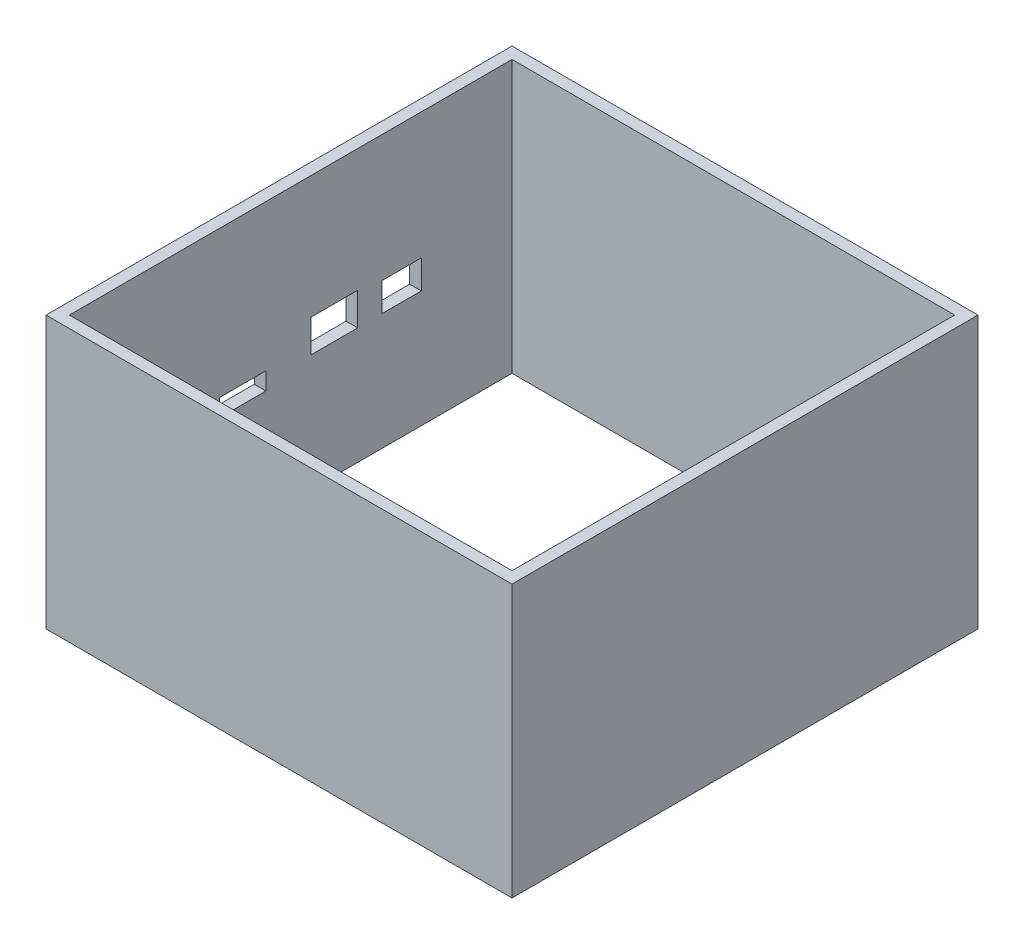
ISO-10303-21;
HEADER;
FILE_DESCRIPTION(('STEP AP214'),'2;1');
FILE_NAME('part.step','',(''),(''),'','','');
FILE_SCHEMA(('AUTOMOTIVE_DESIGN { 1 0 10303 214 1 1 1 1 }'));
ENDSEC;
DATA;
#1=APPLICATION_CONTEXT('core data for automotive mechanical design processes');
#2=APPLICATION_PROTOCOL_DEFINITION('international standard','automotive_design',2000,#1);
#3=PRODUCT_CONTEXT('',#1,'mechanical');
#4=PRODUCT('Part','Part','',(#3));
#5=PRODUCT_RELATED_PRODUCT_CATEGORY('part','',(#4));
#6=PRODUCT_DEFINITION_FORMATION('','',#4);
#7=PRODUCT_DEFINITION_CONTEXT('part definition',#1,'design');
#8=PRODUCT_DEFINITION('design','',#6,#7);
#9=PRODUCT_DEFINITION_SHAPE('','',#8);
#10=(LENGTH_UNIT() NAMED_UNIT(*) SI_UNIT(.MILLI.,.METRE.));
#11=(NAMED_UNIT(*) PLANE_ANGLE_UNIT() SI_UNIT($,.RADIAN.));
#12=(NAMED_UNIT(*) SI_UNIT($,.STERADIAN.) SOLID_ANGLE_UNIT());
#13=UNCERTAINTY_MEASURE_WITH_UNIT(LENGTH_MEASURE(1.E-05),#10,'distance_accuracy_value','');
#14=(GEOMETRIC_REPRESENTATION_CONTEXT(3) GLOBAL_UNCERTAINTY_ASSIGNED_CONTEXT((#13)) GLOBAL_UNIT_ASSIGNED_CONTEXT((#10,
#11,#12)) REPRESENTATION_CONTEXT('',''));
#15=CARTESIAN_POINT('',(0.,0.,0.));
#16=DIRECTION('',(0.,0.,1.));
#17=DIRECTION('',(1.,0.,0.));
#18=AXIS2_PLACEMENT_3D('',#15,#16,#17);
#19=CARTESIAN_POINT('',(-60.,73.,60.));
#20=DIRECTION('',(1.,0.,0.));
#21=DIRECTION('',(0.,0.,-1.));
#22=AXIS2_PLACEMENT_3D('',#19,#20,#21);
#23=PLANE('',#22);
#24=DIRECTION('',(0.,1.,0.));
#25=VECTOR('',#24,1.);
#26=CARTESIAN_POINT('',(-60.,0.,18.3674203577471));
#27=LINE('',#26,#25);
#28=CARTESIAN_POINT('',(-60.,30.75,18.3674203577471));
#29=VERTEX_POINT('',#28);
#30=CARTESIAN_POINT('',(-60.,35.25,18.3674203577471));
#31=VERTEX_POINT('',#30);
#32=EDGE_CURVE('E221',#29,#31,#27,.T.);
#33=ORIENTED_EDGE('',*,*,#32,.F.);
#34=DIRECTION('',(0.,0.,1.));
#35=VECTOR('',#34,1.);
#36=CARTESIAN_POINT('',(-60.,30.75,0.));
#37=LINE('',#36,#35);
#38=CARTESIAN_POINT('',(-60.,30.75,6.36742035774705));
#39=VERTEX_POINT('',#38);
#40=EDGE_CURVE('E265',#39,#29,#37,.T.);
#41=ORIENTED_EDGE('',*,*,#40,.F.);
#42=DIRECTION('',(0.,1.,0.));
#43=VECTOR('',#42,1.);
#44=CARTESIAN_POINT('',(-60.,0.,6.36742035774705));
#45=LINE('',#44,#43);
#46=CARTESIAN_POINT('',(-60.,35.25,6.36742035774705));
#47=VERTEX_POINT('',#46);
#48=EDGE_CURVE('E269',#39,#47,#45,.T.);
#49=ORIENTED_EDGE('',*,*,#48,.T.);
#50=DIRECTION('',(0.,0.,1.));
#51=VECTOR('',#50,1.);
#52=CARTESIAN_POINT('',(-60.,35.25,0.));
#53=LINE('',#52,#51);
#54=EDGE_CURVE('E272',#47,#31,#53,.T.);
#55=ORIENTED_EDGE('',*,*,#54,.T.);
#56=EDGE_LOOP('',(#33,#41,#49,#55));
#57=FACE_BOUND('',#56,.T.);
#58=DIRECTION('',(0.,-1.,0.));
#59=VECTOR('',#58,1.);
#60=CARTESIAN_POINT('',(-60.,0.,-23.5647531211439));
#61=LINE('',#60,#59);
#62=CARTESIAN_POINT('',(-60.,40.4239596536926,-23.5647531211439));
#63=VERTEX_POINT('',#62);
#64=CARTESIAN_POINT('',(-60.,33.0619311208175,-23.5647531211439));
#65=VERTEX_POINT('',#64);
#66=EDGE_CURVE('E275',#63,#65,#61,.T.);
#67=ORIENTED_EDGE('',*,*,#66,.T.);
#68=DIRECTION('',(0.,0.,1.));
#69=VECTOR('',#68,1.);
#70=CARTESIAN_POINT('',(-60.,33.0619311208175,0.));
#71=LINE('',#70,#69);
#72=CARTESIAN_POINT('',(-60.,33.0619311208175,-33.6488101868942));
#73=VERTEX_POINT('',#72);
#74=EDGE_CURVE('E290',#73,#65,#71,.T.);
#75=ORIENTED_EDGE('',*,*,#74,.F.);
#76=DIRECTION('',(0.,-1.,0.));
#77=VECTOR('',#76,1.);
#78=CARTESIAN_POINT('',(-60.,0.,-33.6488101868942));
#79=LINE('',#78,#77);
#80=CARTESIAN_POINT('',(-60.,40.4239596536926,-33.6488101868942));
#81=VERTEX_POINT('',#80);
#82=EDGE_CURVE('E284',#81,#73,#79,.T.);
#83=ORIENTED_EDGE('',*,*,#82,.F.);
#84=DIRECTION('',(0.,0.,1.));
#85=VECTOR('',#84,1.);
#86=CARTESIAN_POINT('',(-60.,40.4239596536926,0.));
#87=LINE('',#86,#85);
#88=EDGE_CURVE('E196',#81,#63,#87,.T.);
#89=ORIENTED_EDGE('',*,*,#88,.T.);
#90=EDGE_LOOP('',(#67,#75,#83,#89));
#91=FACE_BOUND('',#90,.T.);
#92=DIRECTION('',(0.,-1.,0.));
#93=VECTOR('',#92,1.);
#94=CARTESIAN_POINT('',(-60.,73.,60.));
#95=LINE('',#94,#93);
#96=CARTESIAN_POINT('',(-60.,73.,60.));
#97=VERTEX_POINT('',#96);
#98=CARTESIAN_POINT('',(-60.,3.,60.));
#99=VERTEX_POINT('',#98);
#100=EDGE_CURVE('E181',#97,#99,#95,.T.);
#101=ORIENTED_EDGE('',*,*,#100,.F.);
#102=DIRECTION('',(0.,0.,1.));
#103=VECTOR('',#102,1.);
#104=CARTESIAN_POINT('',(-60.,73.,-80.));
#105=LINE('',#104,#103);
#106=CARTESIAN_POINT('',(-60.,73.,-60.));
#107=VERTEX_POINT('',#106);
#108=EDGE_CURVE('E43',#107,#97,#105,.T.);
#109=ORIENTED_EDGE('',*,*,#108,.F.);
#110=DIRECTION('',(0.,-1.,0.));
#111=VECTOR('',#110,1.);
#112=CARTESIAN_POINT('',(-60.,73.,-60.));
#113=LINE('',#112,#111);
#114=CARTESIAN_POINT('',(-60.,3.,-60.));
#115=VERTEX_POINT('',#114);
#116=EDGE_CURVE('E189',#107,#115,#113,.T.);
#117=ORIENTED_EDGE('',*,*,#116,.T.);
#118=DIRECTION('',(0.,0.,1.));
#119=VECTOR('',#118,1.);
#120=CARTESIAN_POINT('',(-60.,3.,60.));
#121=LINE('',#120,#119);
#122=EDGE_CURVE('E173',#115,#99,#121,.T.);
#123=ORIENTED_EDGE('',*,*,#122,.T.);
#124=EDGE_LOOP('',(#101,#109,#117,#123));
#125=FACE_BOUND('',#124,.T.);
#126=DIRECTION('',(0.,1.,0.));
#127=VECTOR('',#126,1.);
#128=CARTESIAN_POINT('',(-60.,0.,-17.2594149314277));
#129=LINE('',#128,#127);
#130=CARTESIAN_POINT('',(-60.,33.,-17.2594149314277));
#131=VERTEX_POINT('',#130);
#132=CARTESIAN_POINT('',(-60.,41.4,-17.2594149314277));
#133=VERTEX_POINT('',#132);
#134=EDGE_CURVE('E191',#131,#133,#129,.T.);
#135=ORIENTED_EDGE('',*,*,#134,.T.);
#136=DIRECTION('',(0.,0.,-1.));
#137=VECTOR('',#136,1.);
#138=CARTESIAN_POINT('',(-60.,41.4,0.));
#139=LINE('',#138,#137);
#140=CARTESIAN_POINT('',(-60.,41.4,-5.25941493142768));
#141=VERTEX_POINT('',#140);
#142=EDGE_CURVE('E247',#141,#133,#139,.T.);
#143=ORIENTED_EDGE('',*,*,#142,.F.);
#144=DIRECTION('',(0.,1.,0.));
#145=VECTOR('',#144,1.);
#146=CARTESIAN_POINT('',(-60.,0.,-5.25941493142768));
#147=LINE('',#146,#145);
#148=CARTESIAN_POINT('',(-60.,33.,-5.25941493142768));
#149=VERTEX_POINT('',#148);
#150=EDGE_CURVE('E241',#149,#141,#147,.T.);
#151=ORIENTED_EDGE('',*,*,#150,.F.);
#152=DIRECTION('',(0.,0.,-1.));
#153=VECTOR('',#152,1.);
#154=CARTESIAN_POINT('',(-60.,33.,0.));
#155=LINE('',#154,#153);
#156=EDGE_CURVE('E194',#149,#131,#155,.T.);
#157=ORIENTED_EDGE('',*,*,#156,.T.);
#158=EDGE_LOOP('',(#135,#143,#151,#157));
#159=FACE_BOUND('',#158,.T.);
#160=ADVANCED_FACE('F33',(#57,#91,#125,#159),#23,.F.);
#161=CARTESIAN_POINT('',(-57.,73.,57.));
#162=DIRECTION('',(1.,0.,0.));
#163=DIRECTION('',(0.,0.,-1.));
#164=AXIS2_PLACEMENT_3D('',#161,#162,#163);
#165=PLANE('',#164);
#166=DIRECTION('',(0.,0.,-1.));
#167=VECTOR('',#166,1.);
#168=CARTESIAN_POINT('',(-57.,30.75,57.));
#169=LINE('',#168,#167);
#170=CARTESIAN_POINT('',(-57.,30.75,18.3674203577471));
#171=VERTEX_POINT('',#170);
#172=CARTESIAN_POINT('',(-57.,30.75,6.36742035774705));
#173=VERTEX_POINT('',#172);
#174=EDGE_CURVE('E268',#171,#173,#169,.T.);
#175=ORIENTED_EDGE('',*,*,#174,.F.);
#176=DIRECTION('',(0.,-1.,0.));
#177=VECTOR('',#176,1.);
#178=CARTESIAN_POINT('',(-57.,73.,18.3674203577471));
#179=LINE('',#178,#177);
#180=CARTESIAN_POINT('',(-57.,35.25,18.3674203577471));
#181=VERTEX_POINT('',#180);
#182=EDGE_CURVE('E260',#181,#171,#179,.T.);
#183=ORIENTED_EDGE('',*,*,#182,.F.);
#184=DIRECTION('',(0.,0.,-1.));
#185=VECTOR('',#184,1.);
#186=CARTESIAN_POINT('',(-57.,35.25,57.));
#187=LINE('',#186,#185);
#188=CARTESIAN_POINT('',(-57.,35.25,6.36742035774705));
#189=VERTEX_POINT('',#188);
#190=EDGE_CURVE('E255',#181,#189,#187,.T.);
#191=ORIENTED_EDGE('',*,*,#190,.T.);
#192=DIRECTION('',(0.,-1.,0.));
#193=VECTOR('',#192,1.);
#194=CARTESIAN_POINT('',(-57.,73.,6.36742035774705));
#195=LINE('',#194,#193);
#196=EDGE_CURVE('E357',#189,#173,#195,.T.);
#197=ORIENTED_EDGE('',*,*,#196,.T.);
#198=EDGE_LOOP('',(#175,#183,#191,#197));
#199=FACE_BOUND('',#198,.T.);
#200=DIRECTION('',(0.,0.,-1.));
#201=VECTOR('',#200,1.);
#202=CARTESIAN_POINT('',(-57.,33.0619311208175,57.));
#203=LINE('',#202,#201);
#204=CARTESIAN_POINT('',(-57.,33.0619311208175,-23.5647531211439));
#205=VERTEX_POINT('',#204);
#206=CARTESIAN_POINT('',(-57.,33.0619311208175,-33.6488101868942));
#207=VERTEX_POINT('',#206);
#208=EDGE_CURVE('E240',#205,#207,#203,.T.);
#209=ORIENTED_EDGE('',*,*,#208,.F.);
#210=DIRECTION('',(0.,1.,0.));
#211=VECTOR('',#210,1.);
#212=CARTESIAN_POINT('',(-57.,73.,-23.5647531211439));
#213=LINE('',#212,#211);
#214=CARTESIAN_POINT('',(-57.,40.4239596536926,-23.5647531211439));
#215=VERTEX_POINT('',#214);
#216=EDGE_CURVE('E341',#205,#215,#213,.T.);
#217=ORIENTED_EDGE('',*,*,#216,.T.);
#218=DIRECTION('',(0.,0.,-1.));
#219=VECTOR('',#218,1.);
#220=CARTESIAN_POINT('',(-57.,40.4239596536926,57.));
#221=LINE('',#220,#219);
#222=CARTESIAN_POINT('',(-57.,40.4239596536926,-33.6488101868942));
#223=VERTEX_POINT('',#222);
#224=EDGE_CURVE('E232',#215,#223,#221,.T.);
#225=ORIENTED_EDGE('',*,*,#224,.T.);
#226=DIRECTION('',(0.,1.,0.));
#227=VECTOR('',#226,1.);
#228=CARTESIAN_POINT('',(-57.,73.,-33.6488101868942));
#229=LINE('',#228,#227);
#230=EDGE_CURVE('E287',#207,#223,#229,.T.);
#231=ORIENTED_EDGE('',*,*,#230,.F.);
#232=EDGE_LOOP('',(#209,#217,#225,#231));
#233=FACE_BOUND('',#232,.T.);
#234=DIRECTION('',(0.,0.,1.));
#235=VECTOR('',#234,1.);
#236=CARTESIAN_POINT('',(-57.,3.,57.));
#237=LINE('',#236,#235);
#238=CARTESIAN_POINT('',(-57.,3.,-57.));
#239=VERTEX_POINT('',#238);
#240=CARTESIAN_POINT('',(-57.,3.,57.));
#241=VERTEX_POINT('',#240);
#242=EDGE_CURVE('E209',#239,#241,#237,.T.);
#243=ORIENTED_EDGE('',*,*,#242,.F.);
#244=DIRECTION('',(0.,-1.,0.));
#245=VECTOR('',#244,1.);
#246=CARTESIAN_POINT('',(-57.,73.,-57.));
#247=LINE('',#246,#245);
#248=CARTESIAN_POINT('',(-57.,73.,-57.));
#249=VERTEX_POINT('',#248);
#250=EDGE_CURVE('E206',#249,#239,#247,.T.);
#251=ORIENTED_EDGE('',*,*,#250,.F.);
#252=DIRECTION('',(0.,0.,1.));
#253=VECTOR('',#252,1.);
#254=CARTESIAN_POINT('',(-57.,73.,57.));
#255=LINE('',#254,#253);
#256=CARTESIAN_POINT('',(-57.,73.,57.));
#257=VERTEX_POINT('',#256);
#258=EDGE_CURVE('E214',#249,#257,#255,.T.);
#259=ORIENTED_EDGE('',*,*,#258,.T.);
#260=DIRECTION('',(0.,-1.,0.));
#261=VECTOR('',#260,1.);
#262=CARTESIAN_POINT('',(-57.,73.,57.));
#263=LINE('',#262,#261);
#264=EDGE_CURVE('E210',#257,#241,#263,.T.);
#265=ORIENTED_EDGE('',*,*,#264,.T.);
#266=EDGE_LOOP('',(#243,#251,#259,#265));
#267=FACE_BOUND('',#266,.T.);
#268=DIRECTION('',(0.,0.,1.));
#269=VECTOR('',#268,1.);
#270=CARTESIAN_POINT('',(-57.,41.4,57.));
#271=LINE('',#270,#269);
#272=CARTESIAN_POINT('',(-57.,41.4,-17.2594149314277));
#273=VERTEX_POINT('',#272);
#274=CARTESIAN_POINT('',(-57.,41.4,-5.25941493142768));
#275=VERTEX_POINT('',#274);
#276=EDGE_CURVE('E248',#273,#275,#271,.T.);
#277=ORIENTED_EDGE('',*,*,#276,.F.);
#278=DIRECTION('',(0.,-1.,0.));
#279=VECTOR('',#278,1.);
#280=CARTESIAN_POINT('',(-57.,73.,-17.2594149314277));
#281=LINE('',#280,#279);
#282=CARTESIAN_POINT('',(-57.,33.,-17.2594149314277));
#283=VERTEX_POINT('',#282);
#284=EDGE_CURVE('E213',#273,#283,#281,.T.);
#285=ORIENTED_EDGE('',*,*,#284,.T.);
#286=DIRECTION('',(0.,0.,1.));
#287=VECTOR('',#286,1.);
#288=CARTESIAN_POINT('',(-57.,33.,57.));
#289=LINE('',#288,#287);
#290=CARTESIAN_POINT('',(-57.,33.,-5.25941493142768));
#291=VERTEX_POINT('',#290);
#292=EDGE_CURVE('E185',#283,#291,#289,.T.);
#293=ORIENTED_EDGE('',*,*,#292,.T.);
#294=DIRECTION('',(0.,-1.,0.));
#295=VECTOR('',#294,1.);
#296=CARTESIAN_POINT('',(-57.,73.,-5.25941493142768));
#297=LINE('',#296,#295);
#298=EDGE_CURVE('E244',#275,#291,#297,.T.);
#299=ORIENTED_EDGE('',*,*,#298,.F.);
#300=EDGE_LOOP('',(#277,#285,#293,#299));
#301=FACE_BOUND('',#300,.T.);
#302=ADVANCED_FACE('F319',(#199,#233,#267,#301),#165,.T.);
#303=CARTESIAN_POINT('',(60.,73.,60.));
#304=DIRECTION('',(0.,0.,-1.));
#305=DIRECTION('',(-1.,0.,0.));
#306=AXIS2_PLACEMENT_3D('',#303,#304,#305);
#307=PLANE('',#306);
#308=DIRECTION('',(0.,-1.,0.));
#309=VECTOR('',#308,1.);
#310=CARTESIAN_POINT('',(60.,73.,60.));
#311=LINE('',#310,#309);
#312=CARTESIAN_POINT('',(60.,73.,60.));
#313=VERTEX_POINT('',#312);
#314=CARTESIAN_POINT('',(60.,3.,60.));
#315=VERTEX_POINT('',#314);
#316=EDGE_CURVE('E301',#313,#315,#311,.T.);
#317=ORIENTED_EDGE('',*,*,#316,.F.);
#318=DIRECTION('',(1.,0.,0.));
#319=VECTOR('',#318,1.);
#320=CARTESIAN_POINT('',(-60.,73.,60.));
#321=LINE('',#320,#319);
#322=EDGE_CURVE('E11',#97,#313,#321,.T.);
#323=ORIENTED_EDGE('',*,*,#322,.F.);
#324=ORIENTED_EDGE('',*,*,#100,.T.);
#325=DIRECTION('',(1.,0.,0.));
#326=VECTOR('',#325,1.);
#327=CARTESIAN_POINT('',(60.,3.,60.));
#328=LINE('',#327,#326);
#329=EDGE_CURVE('E37',#99,#315,#328,.T.);
#330=ORIENTED_EDGE('',*,*,#329,.T.);
#331=EDGE_LOOP('',(#317,#323,#324,#330));
#332=FACE_BOUND('',#331,.T.);
#333=ADVANCED_FACE('F183',(#332),#307,.F.);
#334=CARTESIAN_POINT('',(60.,73.,60.));
#335=DIRECTION('',(-1.,0.,0.));
#336=DIRECTION('',(0.,0.,1.));
#337=AXIS2_PLACEMENT_3D('',#334,#335,#336);
#338=PLANE('',#337);
#339=DIRECTION('',(0.,-1.,0.));
#340=VECTOR('',#339,1.);
#341=CARTESIAN_POINT('',(60.,73.,-60.));
#342=LINE('',#341,#340);
#343=CARTESIAN_POINT('',(60.,73.,-60.));
#344=VERTEX_POINT('',#343);
#345=CARTESIAN_POINT('',(60.,3.,-60.));
#346=VERTEX_POINT('',#345);
#347=EDGE_CURVE('E299',#344,#346,#342,.T.);
#348=ORIENTED_EDGE('',*,*,#347,.F.);
#349=DIRECTION('',(0.,0.,1.));
#350=VECTOR('',#349,1.);
#351=CARTESIAN_POINT('',(60.,73.,-80.));
#352=LINE('',#351,#350);
#353=EDGE_CURVE('E180',#344,#313,#352,.T.);
#354=ORIENTED_EDGE('',*,*,#353,.T.);
#355=ORIENTED_EDGE('',*,*,#316,.T.);
#356=DIRECTION('',(0.,0.,-1.));
#357=VECTOR('',#356,1.);
#358=CARTESIAN_POINT('',(60.,3.,60.));
#359=LINE('',#358,#357);
#360=EDGE_CURVE('E176',#315,#346,#359,.T.);
#361=ORIENTED_EDGE('',*,*,#360,.T.);
#362=EDGE_LOOP('',(#348,#354,#355,#361));
#363=FACE_BOUND('',#362,.T.);
#364=ADVANCED_FACE('F310',(#363),#338,.F.);
#365=CARTESIAN_POINT('',(60.,73.,-60.));
#366=DIRECTION('',(0.,0.,1.));
#367=DIRECTION('',(1.,0.,0.));
#368=AXIS2_PLACEMENT_3D('',#365,#366,#367);
#369=PLANE('',#368);
#370=ORIENTED_EDGE('',*,*,#116,.F.);
#371=DIRECTION('',(1.,0.,0.));
#372=VECTOR('',#371,1.);
#373=CARTESIAN_POINT('',(60.,73.,-60.));
#374=LINE('',#373,#372);
#375=EDGE_CURVE('E51',#107,#344,#374,.T.);
#376=ORIENTED_EDGE('',*,*,#375,.T.);
#377=ORIENTED_EDGE('',*,*,#347,.T.);
#378=DIRECTION('',(-1.,0.,0.));
#379=VECTOR('',#378,1.);
#380=CARTESIAN_POINT('',(60.,3.,-60.));
#381=LINE('',#380,#379);
#382=EDGE_CURVE('E229',#346,#115,#381,.T.);
#383=ORIENTED_EDGE('',*,*,#382,.T.);
#384=EDGE_LOOP('',(#370,#376,#377,#383));
#385=FACE_BOUND('',#384,.T.);
#386=ADVANCED_FACE('F309',(#385),#369,.F.);
#387=CARTESIAN_POINT('',(-57.,73.,57.));
#388=DIRECTION('',(0.,0.,-1.));
#389=DIRECTION('',(-1.,0.,0.));
#390=AXIS2_PLACEMENT_3D('',#387,#388,#389);
#391=PLANE('',#390);
#392=DIRECTION('',(1.,0.,0.));
#393=VECTOR('',#392,1.);
#394=CARTESIAN_POINT('',(-57.,3.,57.));
#395=LINE('',#394,#393);
#396=CARTESIAN_POINT('',(57.,3.,57.));
#397=VERTEX_POINT('',#396);
#398=EDGE_CURVE('E218',#241,#397,#395,.T.);
#399=ORIENTED_EDGE('',*,*,#398,.F.);
#400=ORIENTED_EDGE('',*,*,#264,.F.);
#401=DIRECTION('',(1.,0.,0.));
#402=VECTOR('',#401,1.);
#403=CARTESIAN_POINT('',(-57.,73.,57.));
#404=LINE('',#403,#402);
#405=CARTESIAN_POINT('',(57.,73.,57.));
#406=VERTEX_POINT('',#405);
#407=EDGE_CURVE('E88',#257,#406,#404,.T.);
#408=ORIENTED_EDGE('',*,*,#407,.T.);
#409=DIRECTION('',(0.,-1.,0.));
#410=VECTOR('',#409,1.);
#411=CARTESIAN_POINT('',(57.,73.,57.));
#412=LINE('',#411,#410);
#413=EDGE_CURVE('E215',#406,#397,#412,.T.);
#414=ORIENTED_EDGE('',*,*,#413,.T.);
#415=EDGE_LOOP('',(#399,#400,#408,#414));
#416=FACE_BOUND('',#415,.T.);
#417=ADVANCED_FACE('F317',(#416),#391,.T.);
#418=CARTESIAN_POINT('',(57.,73.,57.));
#419=DIRECTION('',(-1.,0.,0.));
#420=DIRECTION('',(0.,0.,1.));
#421=AXIS2_PLACEMENT_3D('',#418,#419,#420);
#422=PLANE('',#421);
#423=DIRECTION('',(0.,0.,-1.));
#424=VECTOR('',#423,1.);
#425=CARTESIAN_POINT('',(57.,3.,57.));
#426=LINE('',#425,#424);
#427=CARTESIAN_POINT('',(57.,3.,-57.));
#428=VERTEX_POINT('',#427);
#429=EDGE_CURVE('E220',#397,#428,#426,.T.);
#430=ORIENTED_EDGE('',*,*,#429,.F.);
#431=ORIENTED_EDGE('',*,*,#413,.F.);
#432=DIRECTION('',(0.,0.,-1.));
#433=VECTOR('',#432,1.);
#434=CARTESIAN_POINT('',(57.,73.,57.));
#435=LINE('',#434,#433);
#436=CARTESIAN_POINT('',(57.,73.,-57.));
#437=VERTEX_POINT('',#436);
#438=EDGE_CURVE('E205',#406,#437,#435,.T.);
#439=ORIENTED_EDGE('',*,*,#438,.T.);
#440=DIRECTION('',(0.,-1.,0.));
#441=VECTOR('',#440,1.);
#442=CARTESIAN_POINT('',(57.,73.,-57.));
#443=LINE('',#442,#441);
#444=EDGE_CURVE('E201',#437,#428,#443,.T.);
#445=ORIENTED_EDGE('',*,*,#444,.T.);
#446=EDGE_LOOP('',(#430,#431,#439,#445));
#447=FACE_BOUND('',#446,.T.);
#448=ADVANCED_FACE('F516',(#447),#422,.T.);
#449=CARTESIAN_POINT('',(-57.,73.,-57.));
#450=DIRECTION('',(0.,0.,1.));
#451=DIRECTION('',(1.,0.,0.));
#452=AXIS2_PLACEMENT_3D('',#449,#450,#451);
#453=PLANE('',#452);
#454=DIRECTION('',(-1.,0.,0.));
#455=VECTOR('',#454,1.);
#456=CARTESIAN_POINT('',(-57.,3.,-57.));
#457=LINE('',#456,#455);
#458=EDGE_CURVE('E224',#428,#239,#457,.T.);
#459=ORIENTED_EDGE('',*,*,#458,.F.);
#460=ORIENTED_EDGE('',*,*,#444,.F.);
#461=DIRECTION('',(-1.,0.,0.));
#462=VECTOR('',#461,1.);
#463=CARTESIAN_POINT('',(-57.,73.,-57.));
#464=LINE('',#463,#462);
#465=EDGE_CURVE('E204',#437,#249,#464,.T.);
#466=ORIENTED_EDGE('',*,*,#465,.T.);
#467=ORIENTED_EDGE('',*,*,#250,.T.);
#468=EDGE_LOOP('',(#459,#460,#466,#467));
#469=FACE_BOUND('',#468,.T.);
#470=ADVANCED_FACE('F461',(#469),#453,.T.);
#471=CARTESIAN_POINT('',(-55.452,3.,27.2274203577471));
#472=DIRECTION('',(0.,1.,0.));
#473=DIRECTION('',(0.,0.,1.));
#474=AXIS2_PLACEMENT_3D('',#471,#472,#473);
#475=PLANE('',#474);
#476=ORIENTED_EDGE('',*,*,#242,.T.);
#477=ORIENTED_EDGE('',*,*,#398,.T.);
#478=ORIENTED_EDGE('',*,*,#429,.T.);
#479=ORIENTED_EDGE('',*,*,#458,.T.);
#480=EDGE_LOOP('',(#476,#477,#478,#479));
#481=FACE_BOUND('',#480,.T.);
#482=ORIENTED_EDGE('',*,*,#382,.F.);
#483=ORIENTED_EDGE('',*,*,#360,.F.);
#484=ORIENTED_EDGE('',*,*,#329,.F.);
#485=ORIENTED_EDGE('',*,*,#122,.F.);
#486=EDGE_LOOP('',(#482,#483,#484,#485));
#487=FACE_BOUND('',#486,.T.);
#488=ADVANCED_FACE('F171',(#481,#487),#475,.F.);
#489=CARTESIAN_POINT('',(-55.,0.,-17.2594149314277));
#490=DIRECTION('',(0.,0.,1.));
#491=DIRECTION('',(1.,0.,0.));
#492=AXIS2_PLACEMENT_3D('',#489,#490,#491);
#493=PLANE('',#492);
#494=DIRECTION('',(-1.,0.,0.));
#495=VECTOR('',#494,1.);
#496=CARTESIAN_POINT('',(-55.,41.4,-17.2594149314277));
#497=LINE('',#496,#495);
#498=EDGE_CURVE('E223',#273,#133,#497,.T.);
#499=ORIENTED_EDGE('',*,*,#498,.T.);
#500=ORIENTED_EDGE('',*,*,#134,.F.);
#501=DIRECTION('',(-1.,0.,0.));
#502=VECTOR('',#501,1.);
#503=CARTESIAN_POINT('',(-55.,33.,-17.2594149314277));
#504=LINE('',#503,#502);
#505=EDGE_CURVE('E237',#283,#131,#504,.T.);
#506=ORIENTED_EDGE('',*,*,#505,.F.);
#507=ORIENTED_EDGE('',*,*,#284,.F.);
#508=EDGE_LOOP('',(#499,#500,#506,#507));
#509=FACE_BOUND('',#508,.T.);
#510=ADVANCED_FACE('F371',(#509),#493,.T.);
#511=CARTESIAN_POINT('',(-55.,41.4,0.));
#512=DIRECTION('',(0.,1.,0.));
#513=DIRECTION('',(0.,0.,1.));
#514=AXIS2_PLACEMENT_3D('',#511,#512,#513);
#515=PLANE('',#514);
#516=ORIENTED_EDGE('',*,*,#276,.T.);
#517=DIRECTION('',(-1.,0.,0.));
#518=VECTOR('',#517,1.);
#519=CARTESIAN_POINT('',(-55.,41.4,-5.25941493142768));
#520=LINE('',#519,#518);
#521=EDGE_CURVE('E245',#275,#141,#520,.T.);
#522=ORIENTED_EDGE('',*,*,#521,.T.);
#523=ORIENTED_EDGE('',*,*,#142,.T.);
#524=ORIENTED_EDGE('',*,*,#498,.F.);
#525=EDGE_LOOP('',(#516,#522,#523,#524));
#526=FACE_BOUND('',#525,.T.);
#527=ADVANCED_FACE('F379',(#526),#515,.F.);
#528=CARTESIAN_POINT('',(-55.,0.,-5.25941493142768));
#529=DIRECTION('',(0.,0.,1.));
#530=DIRECTION('',(1.,0.,0.));
#531=AXIS2_PLACEMENT_3D('',#528,#529,#530);
#532=PLANE('',#531);
#533=ORIENTED_EDGE('',*,*,#298,.T.);
#534=DIRECTION('',(-1.,0.,0.));
#535=VECTOR('',#534,1.);
#536=CARTESIAN_POINT('',(-55.,33.,-5.25941493142768));
#537=LINE('',#536,#535);
#538=EDGE_CURVE('E242',#291,#149,#537,.T.);
#539=ORIENTED_EDGE('',*,*,#538,.T.);
#540=ORIENTED_EDGE('',*,*,#150,.T.);
#541=ORIENTED_EDGE('',*,*,#521,.F.);
#542=EDGE_LOOP('',(#533,#539,#540,#541));
#543=FACE_BOUND('',#542,.T.);
#544=ADVANCED_FACE('F377',(#543),#532,.F.);
#545=CARTESIAN_POINT('',(-55.,33.,0.));
#546=DIRECTION('',(0.,1.,0.));
#547=DIRECTION('',(0.,0.,1.));
#548=AXIS2_PLACEMENT_3D('',#545,#546,#547);
#549=PLANE('',#548);
#550=ORIENTED_EDGE('',*,*,#505,.T.);
#551=ORIENTED_EDGE('',*,*,#156,.F.);
#552=ORIENTED_EDGE('',*,*,#538,.F.);
#553=ORIENTED_EDGE('',*,*,#292,.F.);
#554=EDGE_LOOP('',(#550,#551,#552,#553));
#555=FACE_BOUND('',#554,.T.);
#556=ADVANCED_FACE('F368',(#555),#549,.T.);
#557=CARTESIAN_POINT('',(-55.,33.0619311208175,0.));
#558=DIRECTION('',(0.,-1.,0.));
#559=DIRECTION('',(0.,0.,-1.));
#560=AXIS2_PLACEMENT_3D('',#557,#558,#559);
#561=PLANE('',#560);
#562=ORIENTED_EDGE('',*,*,#208,.T.);
#563=DIRECTION('',(-1.,0.,0.));
#564=VECTOR('',#563,1.);
#565=CARTESIAN_POINT('',(-55.,33.0619311208175,-33.6488101868942));
#566=LINE('',#565,#564);
#567=EDGE_CURVE('E288',#207,#73,#566,.T.);
#568=ORIENTED_EDGE('',*,*,#567,.T.);
#569=ORIENTED_EDGE('',*,*,#74,.T.);
#570=DIRECTION('',(-1.,0.,0.));
#571=VECTOR('',#570,1.);
#572=CARTESIAN_POINT('',(-55.,33.0619311208175,-23.5647531211439));
#573=LINE('',#572,#571);
#574=EDGE_CURVE('E279',#205,#65,#573,.T.);
#575=ORIENTED_EDGE('',*,*,#574,.F.);
#576=EDGE_LOOP('',(#562,#568,#569,#575));
#577=FACE_BOUND('',#576,.T.);
#578=ADVANCED_FACE('F344',(#577),#561,.F.);
#579=CARTESIAN_POINT('',(-55.,0.,-33.6488101868942));
#580=DIRECTION('',(0.,0.,-1.));
#581=DIRECTION('',(-1.,0.,0.));
#582=AXIS2_PLACEMENT_3D('',#579,#580,#581);
#583=PLANE('',#582);
#584=ORIENTED_EDGE('',*,*,#230,.T.);
#585=DIRECTION('',(-1.,0.,0.));
#586=VECTOR('',#585,1.);
#587=CARTESIAN_POINT('',(-55.,40.4239596536926,-33.6488101868942));
#588=LINE('',#587,#586);
#589=EDGE_CURVE('E285',#223,#81,#588,.T.);
#590=ORIENTED_EDGE('',*,*,#589,.T.);
#591=ORIENTED_EDGE('',*,*,#82,.T.);
#592=ORIENTED_EDGE('',*,*,#567,.F.);
#593=EDGE_LOOP('',(#584,#590,#591,#592));
#594=FACE_BOUND('',#593,.T.);
#595=ADVANCED_FACE('F408',(#594),#583,.F.);
#596=CARTESIAN_POINT('',(-55.,40.4239596536926,0.));
#597=DIRECTION('',(0.,-1.,0.));
#598=DIRECTION('',(0.,0.,-1.));
#599=AXIS2_PLACEMENT_3D('',#596,#597,#598);
#600=PLANE('',#599);
#601=DIRECTION('',(-1.,0.,0.));
#602=VECTOR('',#601,1.);
#603=CARTESIAN_POINT('',(-55.,40.4239596536926,-23.5647531211439));
#604=LINE('',#603,#602);
#605=EDGE_CURVE('E282',#215,#63,#604,.T.);
#606=ORIENTED_EDGE('',*,*,#605,.T.);
#607=ORIENTED_EDGE('',*,*,#88,.F.);
#608=ORIENTED_EDGE('',*,*,#589,.F.);
#609=ORIENTED_EDGE('',*,*,#224,.F.);
#610=EDGE_LOOP('',(#606,#607,#608,#609));
#611=FACE_BOUND('',#610,.T.);
#612=ADVANCED_FACE('F411',(#611),#600,.T.);
#613=CARTESIAN_POINT('',(-55.,0.,-23.5647531211439));
#614=DIRECTION('',(0.,0.,-1.));
#615=DIRECTION('',(-1.,0.,0.));
#616=AXIS2_PLACEMENT_3D('',#613,#614,#615);
#617=PLANE('',#616);
#618=ORIENTED_EDGE('',*,*,#574,.T.);
#619=ORIENTED_EDGE('',*,*,#66,.F.);
#620=ORIENTED_EDGE('',*,*,#605,.F.);
#621=ORIENTED_EDGE('',*,*,#216,.F.);
#622=EDGE_LOOP('',(#618,#619,#620,#621));
#623=FACE_BOUND('',#622,.T.);
#624=ADVANCED_FACE('F337',(#623),#617,.T.);
#625=CARTESIAN_POINT('',(-55.,30.75,0.));
#626=DIRECTION('',(0.,-1.,0.));
#627=DIRECTION('',(0.,0.,-1.));
#628=AXIS2_PLACEMENT_3D('',#625,#626,#627);
#629=PLANE('',#628);
#630=ORIENTED_EDGE('',*,*,#174,.T.);
#631=DIRECTION('',(-1.,0.,0.));
#632=VECTOR('',#631,1.);
#633=CARTESIAN_POINT('',(-55.,30.75,6.36742035774705));
#634=LINE('',#633,#632);
#635=EDGE_CURVE('E266',#173,#39,#634,.T.);
#636=ORIENTED_EDGE('',*,*,#635,.T.);
#637=ORIENTED_EDGE('',*,*,#40,.T.);
#638=DIRECTION('',(-1.,0.,0.));
#639=VECTOR('',#638,1.);
#640=CARTESIAN_POINT('',(-55.,30.75,18.3674203577471));
#641=LINE('',#640,#639);
#642=EDGE_CURVE('E257',#171,#29,#641,.T.);
#643=ORIENTED_EDGE('',*,*,#642,.F.);
#644=EDGE_LOOP('',(#630,#636,#637,#643));
#645=FACE_BOUND('',#644,.T.);
#646=ADVANCED_FACE('F390',(#645),#629,.F.);
#647=CARTESIAN_POINT('',(-55.,0.,6.36742035774705));
#648=DIRECTION('',(0.,0.,1.));
#649=DIRECTION('',(1.,0.,0.));
#650=AXIS2_PLACEMENT_3D('',#647,#648,#649);
#651=PLANE('',#650);
#652=DIRECTION('',(-1.,0.,0.));
#653=VECTOR('',#652,1.);
#654=CARTESIAN_POINT('',(-55.,35.25,6.36742035774705));
#655=LINE('',#654,#653);
#656=EDGE_CURVE('E263',#189,#47,#655,.T.);
#657=ORIENTED_EDGE('',*,*,#656,.T.);
#658=ORIENTED_EDGE('',*,*,#48,.F.);
#659=ORIENTED_EDGE('',*,*,#635,.F.);
#660=ORIENTED_EDGE('',*,*,#196,.F.);
#661=EDGE_LOOP('',(#657,#658,#659,#660));
#662=FACE_BOUND('',#661,.T.);
#663=ADVANCED_FACE('F393',(#662),#651,.T.);
#664=CARTESIAN_POINT('',(-55.,35.25,0.));
#665=DIRECTION('',(0.,-1.,0.));
#666=DIRECTION('',(0.,0.,-1.));
#667=AXIS2_PLACEMENT_3D('',#664,#665,#666);
#668=PLANE('',#667);
#669=DIRECTION('',(-1.,0.,0.));
#670=VECTOR('',#669,1.);
#671=CARTESIAN_POINT('',(-55.,35.25,18.3674203577471));
#672=LINE('',#671,#670);
#673=EDGE_CURVE('E261',#181,#31,#672,.T.);
#674=ORIENTED_EDGE('',*,*,#673,.T.);
#675=ORIENTED_EDGE('',*,*,#54,.F.);
#676=ORIENTED_EDGE('',*,*,#656,.F.);
#677=ORIENTED_EDGE('',*,*,#190,.F.);
#678=EDGE_LOOP('',(#674,#675,#676,#677));
#679=FACE_BOUND('',#678,.T.);
#680=ADVANCED_FACE('F398',(#679),#668,.T.);
#681=CARTESIAN_POINT('',(-55.,0.,18.3674203577471));
#682=DIRECTION('',(0.,0.,1.));
#683=DIRECTION('',(1.,0.,0.));
#684=AXIS2_PLACEMENT_3D('',#681,#682,#683);
#685=PLANE('',#684);
#686=ORIENTED_EDGE('',*,*,#182,.T.);
#687=ORIENTED_EDGE('',*,*,#642,.T.);
#688=ORIENTED_EDGE('',*,*,#32,.T.);
#689=ORIENTED_EDGE('',*,*,#673,.F.);
#690=EDGE_LOOP('',(#686,#687,#688,#689));
#691=FACE_BOUND('',#690,.T.);
#692=ADVANCED_FACE('F395',(#691),#685,.F.);
#693=CARTESIAN_POINT('',(-60.,73.,-80.));
#694=DIRECTION('',(0.,-1.,0.));
#695=DIRECTION('',(0.,0.,-1.));
#696=AXIS2_PLACEMENT_3D('',#693,#694,#695);
#697=PLANE('',#696);
#698=ORIENTED_EDGE('',*,*,#258,.F.);
#699=ORIENTED_EDGE('',*,*,#465,.F.);
#700=ORIENTED_EDGE('',*,*,#438,.F.);
#701=ORIENTED_EDGE('',*,*,#407,.F.);
#702=EDGE_LOOP('',(#698,#699,#700,#701));
#703=FACE_BOUND('',#702,.T.);
#704=ORIENTED_EDGE('',*,*,#108,.T.);
#705=ORIENTED_EDGE('',*,*,#322,.T.);
#706=ORIENTED_EDGE('',*,*,#353,.F.);
#707=ORIENTED_EDGE('',*,*,#375,.F.);
#708=EDGE_LOOP('',(#704,#705,#706,#707));
#709=FACE_BOUND('',#708,.T.);
#710=ADVANCED_FACE('F35',(#703,#709),#697,.F.);
#711=CLOSED_SHELL('',(#160,#302,#333,#364,#386,#417,#448,#470,#488,#510,#527,#544,#556,#578,
#595,#612,#624,#646,#663,#680,#692,#710));
#712=MANIFOLD_SOLID_BREP('B2',#711);
#713=ADVANCED_BREP_SHAPE_REPRESENTATION('',(#18,#712),#14);
#714=SHAPE_DEFINITION_REPRESENTATION(#9,#713);
ENDSEC;
END-ISO-10303-21;
